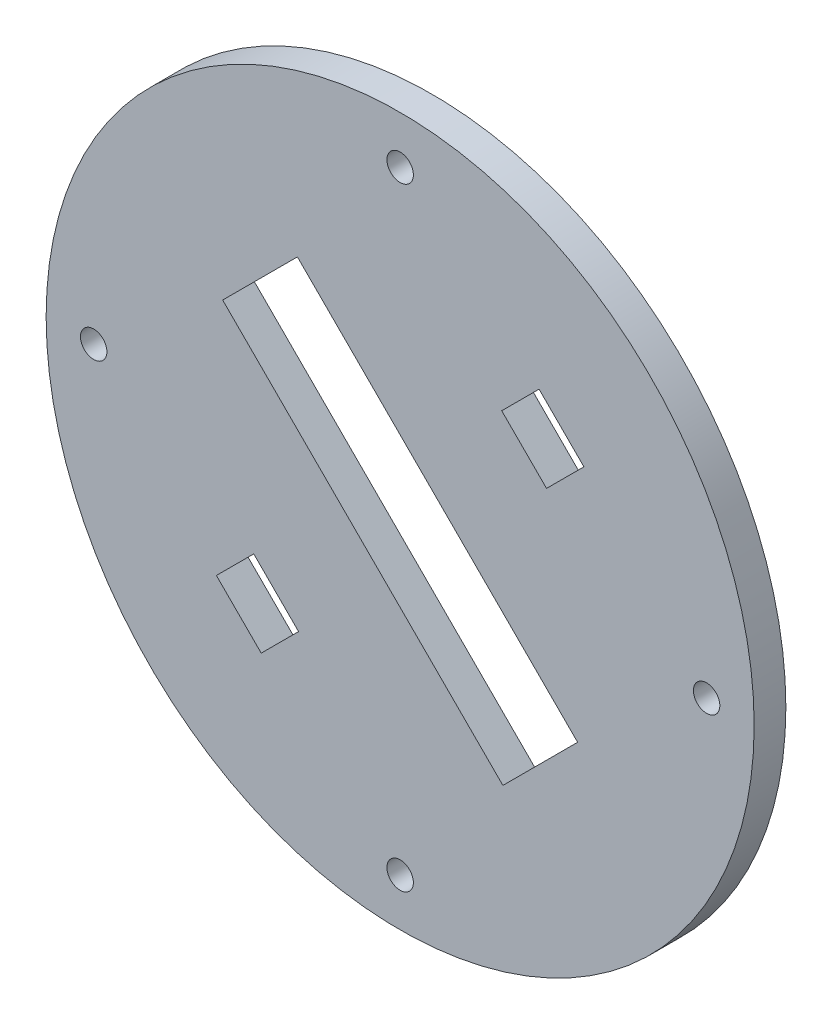
ISO-10303-21;
HEADER;
FILE_DESCRIPTION(('STEP AP214'),'2;1');
FILE_NAME('part.step','',(''),(''),'','','');
FILE_SCHEMA(('AUTOMOTIVE_DESIGN { 1 0 10303 214 1 1 1 1 }'));
ENDSEC;
DATA;
#1=APPLICATION_CONTEXT('core data for automotive mechanical design processes');
#2=APPLICATION_PROTOCOL_DEFINITION('international standard','automotive_design',2000,#1);
#3=PRODUCT_CONTEXT('',#1,'mechanical');
#4=PRODUCT('Part','Part','',(#3));
#5=PRODUCT_RELATED_PRODUCT_CATEGORY('part','',(#4));
#6=PRODUCT_DEFINITION_FORMATION('','',#4);
#7=PRODUCT_DEFINITION_CONTEXT('part definition',#1,'design');
#8=PRODUCT_DEFINITION('design','',#6,#7);
#9=PRODUCT_DEFINITION_SHAPE('','',#8);
#10=(LENGTH_UNIT() NAMED_UNIT(*) SI_UNIT(.MILLI.,.METRE.));
#11=(NAMED_UNIT(*) PLANE_ANGLE_UNIT() SI_UNIT($,.RADIAN.));
#12=(NAMED_UNIT(*) SI_UNIT($,.STERADIAN.) SOLID_ANGLE_UNIT());
#13=UNCERTAINTY_MEASURE_WITH_UNIT(LENGTH_MEASURE(1.E-05),#10,'distance_accuracy_value','');
#14=(GEOMETRIC_REPRESENTATION_CONTEXT(3) GLOBAL_UNCERTAINTY_ASSIGNED_CONTEXT((#13)) GLOBAL_UNIT_ASSIGNED_CONTEXT((#10,
#11,#12)) REPRESENTATION_CONTEXT('',''));
#15=CARTESIAN_POINT('',(0.,0.,0.));
#16=DIRECTION('',(0.,0.,1.));
#17=DIRECTION('',(1.,0.,0.));
#18=AXIS2_PLACEMENT_3D('',#15,#16,#17);
#19=CARTESIAN_POINT('',(0.,0.,6.));
#20=DIRECTION('',(0.,0.,1.));
#21=DIRECTION('',(1.,0.,0.));
#22=AXIS2_PLACEMENT_3D('',#19,#20,#21);
#23=PLANE('',#22);
#24=DIRECTION('',(0.70710678118655,-0.707106781186545,0.));
#25=VECTOR('',#24,1.);
#26=CARTESIAN_POINT('',(-30.5355339059326,-30.5355339059328,6.));
#27=LINE('',#26,#25);
#28=CARTESIAN_POINT('',(-34.7781743393153,-26.2928934725502,6.));
#29=VERTEX_POINT('',#28);
#30=CARTESIAN_POINT('',(-26.2928934725501,-34.7781743393153,6.));
#31=VERTEX_POINT('',#30);
#32=EDGE_CURVE('E137',#29,#31,#27,.T.);
#33=ORIENTED_EDGE('',*,*,#32,.F.);
#34=DIRECTION('',(-0.707106781186547,-0.707106781186548,0.));
#35=VECTOR('',#34,1.);
#36=CARTESIAN_POINT('',(-27.7071065274499,-19.2218256606847,6.));
#37=LINE('',#36,#35);
#38=CARTESIAN_POINT('',(-27.7071065274499,-19.2218256606847,6.));
#39=VERTEX_POINT('',#38);
#40=EDGE_CURVE('E144',#39,#29,#37,.T.);
#41=ORIENTED_EDGE('',*,*,#40,.F.);
#42=DIRECTION('',(-0.707106781186551,0.707106781186544,0.));
#43=VECTOR('',#42,1.);
#44=CARTESIAN_POINT('',(-23.4644660940672,-23.4644660940674,6.));
#45=LINE('',#44,#43);
#46=CARTESIAN_POINT('',(-19.2218256606845,-27.70710652745,6.));
#47=VERTEX_POINT('',#46);
#48=EDGE_CURVE('E126',#47,#39,#45,.T.);
#49=ORIENTED_EDGE('',*,*,#48,.F.);
#50=DIRECTION('',(0.707106781186561,0.707106781186534,0.));
#51=VECTOR('',#50,1.);
#52=CARTESIAN_POINT('',(-26.2928934725501,-34.7781743393153,6.));
#53=LINE('',#52,#51);
#54=EDGE_CURVE('E149',#31,#47,#53,.T.);
#55=ORIENTED_EDGE('',*,*,#54,.F.);
#56=EDGE_LOOP('',(#33,#41,#49,#55));
#57=FACE_BOUND('',#56,.T.);
#58=DIRECTION('',(0.707106781186536,0.707106781186559,0.));
#59=VECTOR('',#58,1.);
#60=CARTESIAN_POINT('',(34.7781743393152,26.2928934725497,6.));
#61=LINE('',#60,#59);
#62=CARTESIAN_POINT('',(27.7071065274498,19.2218256606841,6.));
#63=VERTEX_POINT('',#62);
#64=CARTESIAN_POINT('',(34.7781743393152,26.2928934725497,6.));
#65=VERTEX_POINT('',#64);
#66=EDGE_CURVE('E157',#63,#65,#61,.T.);
#67=ORIENTED_EDGE('',*,*,#66,.F.);
#68=DIRECTION('',(0.707106781186541,-0.707106781186554,0.));
#69=VECTOR('',#68,1.);
#70=CARTESIAN_POINT('',(23.4644660940672,23.4644660940668,6.));
#71=LINE('',#70,#69);
#72=CARTESIAN_POINT('',(19.2218256606846,27.7071065274495,6.));
#73=VERTEX_POINT('',#72);
#74=EDGE_CURVE('E192',#73,#63,#71,.T.);
#75=ORIENTED_EDGE('',*,*,#74,.F.);
#76=DIRECTION('',(-0.707106781186549,-0.707106781186546,0.));
#77=VECTOR('',#76,1.);
#78=CARTESIAN_POINT('',(19.2218256606846,27.7071065274495,6.));
#79=LINE('',#78,#77);
#80=CARTESIAN_POINT('',(26.29289347255,34.7781743393149,6.));
#81=VERTEX_POINT('',#80);
#82=EDGE_CURVE('E165',#81,#73,#79,.T.);
#83=ORIENTED_EDGE('',*,*,#82,.F.);
#84=DIRECTION('',(-0.707106781186542,0.707106781186553,0.));
#85=VECTOR('',#84,1.);
#86=CARTESIAN_POINT('',(30.5355339059327,30.5355339059322,6.));
#87=LINE('',#86,#85);
#88=EDGE_CURVE('E194',#65,#81,#87,.T.);
#89=ORIENTED_EDGE('',*,*,#88,.F.);
#90=EDGE_LOOP('',(#67,#75,#83,#89));
#91=FACE_BOUND('',#90,.T.);
#92=CARTESIAN_POINT('',(1.0373899182872E-12,-58.0000000000016,6.));
#93=DIRECTION('',(0.,0.,1.));
#94=DIRECTION('',(1.,0.,0.));
#95=AXIS2_PLACEMENT_3D('',#92,#93,#94);
#96=CIRCLE('',#95,2.5000000000009);
#97=CARTESIAN_POINT('',(2.50000000000194,-58.0000000000016,6.));
#98=VERTEX_POINT('',#97);
#99=EDGE_CURVE('E203',#98,#98,#96,.T.);
#100=ORIENTED_EDGE('',*,*,#99,.F.);
#101=EDGE_LOOP('',(#100));
#102=FACE_BOUND('',#101,.T.);
#103=CARTESIAN_POINT('',(2.2382195213345E-12,58.0000000000016,6.));
#104=DIRECTION('',(0.,0.,1.));
#105=DIRECTION('',(1.,0.,0.));
#106=AXIS2_PLACEMENT_3D('',#103,#104,#105);
#107=CIRCLE('',#106,2.49999999999738);
#108=CARTESIAN_POINT('',(2.49999999999962,58.0000000000016,6.));
#109=VERTEX_POINT('',#108);
#110=EDGE_CURVE('E215',#109,#109,#107,.T.);
#111=ORIENTED_EDGE('',*,*,#110,.F.);
#112=EDGE_LOOP('',(#111));
#113=FACE_BOUND('',#112,.T.);
#114=CARTESIAN_POINT('',(0.,0.,6.));
#115=DIRECTION('',(0.,0.,1.));
#116=DIRECTION('',(1.,0.,0.));
#117=AXIS2_PLACEMENT_3D('',#114,#115,#116);
#118=CIRCLE('',#117,67.);
#119=CARTESIAN_POINT('',(67.,0.,6.));
#120=VERTEX_POINT('',#119);
#121=EDGE_CURVE('E221',#120,#120,#118,.T.);
#122=ORIENTED_EDGE('',*,*,#121,.T.);
#123=EDGE_LOOP('',(#122));
#124=FACE_BOUND('',#123,.T.);
#125=CARTESIAN_POINT('',(58.0000000000033,-6.0041480152365E-13,6.));
#126=DIRECTION('',(0.,0.,1.));
#127=DIRECTION('',(1.,0.,0.));
#128=AXIS2_PLACEMENT_3D('',#125,#126,#127);
#129=CIRCLE('',#128,2.49999999999866);
#130=CARTESIAN_POINT('',(60.5000000000019,-6.0041480152365E-13,6.));
#131=VERTEX_POINT('',#130);
#132=EDGE_CURVE('E209',#131,#131,#129,.T.);
#133=ORIENTED_EDGE('',*,*,#132,.F.);
#134=EDGE_LOOP('',(#133));
#135=FACE_BOUND('',#134,.T.);
#136=CARTESIAN_POINT('',(-58.,6.07517752958705E-13,6.));
#137=DIRECTION('',(0.,0.,1.));
#138=DIRECTION('',(1.,0.,0.));
#139=AXIS2_PLACEMENT_3D('',#136,#137,#138);
#140=CIRCLE('',#139,2.5);
#141=CARTESIAN_POINT('',(-55.5,6.07517752958705E-13,6.));
#142=VERTEX_POINT('',#141);
#143=EDGE_CURVE('E197',#142,#142,#140,.T.);
#144=ORIENTED_EDGE('',*,*,#143,.F.);
#145=EDGE_LOOP('',(#144));
#146=FACE_BOUND('',#145,.T.);
#147=DIRECTION('',(-0.707106781186549,-0.707106781186546,0.));
#148=VECTOR('',#147,1.);
#149=CARTESIAN_POINT('',(-19.44543648263,33.5875721063611,6.));
#150=LINE('',#149,#148);
#151=CARTESIAN_POINT('',(-19.44543648263,33.5875721063611,6.));
#152=VERTEX_POINT('',#151);
#153=CARTESIAN_POINT('',(-33.587572106361,19.4454364826301,6.));
#154=VERTEX_POINT('',#153);
#155=EDGE_CURVE('E183',#152,#154,#150,.T.);
#156=ORIENTED_EDGE('',*,*,#155,.F.);
#157=DIRECTION('',(0.707106781186546,-0.707106781186549,0.));
#158=VECTOR('',#157,1.);
#159=CARTESIAN_POINT('',(-19.44543648263,33.5875721063611,6.));
#160=LINE('',#159,#158);
#161=CARTESIAN_POINT('',(33.587572106361,-19.4454364826301,6.));
#162=VERTEX_POINT('',#161);
#163=EDGE_CURVE('E51',#152,#162,#160,.T.);
#164=ORIENTED_EDGE('',*,*,#163,.T.);
#165=DIRECTION('',(-0.707106781186549,-0.707106781186546,0.));
#166=VECTOR('',#165,1.);
#167=CARTESIAN_POINT('',(33.587572106361,-19.4454364826301,6.));
#168=LINE('',#167,#166);
#169=CARTESIAN_POINT('',(19.44543648263,-33.587572106361,6.));
#170=VERTEX_POINT('',#169);
#171=EDGE_CURVE('E177',#162,#170,#168,.T.);
#172=ORIENTED_EDGE('',*,*,#171,.T.);
#173=DIRECTION('',(0.707106781186546,-0.707106781186549,0.));
#174=VECTOR('',#173,1.);
#175=CARTESIAN_POINT('',(-33.587572106361,19.4454364826301,6.));
#176=LINE('',#175,#174);
#177=EDGE_CURVE('E180',#154,#170,#176,.T.);
#178=ORIENTED_EDGE('',*,*,#177,.F.);
#179=EDGE_LOOP('',(#156,#164,#172,#178));
#180=FACE_BOUND('',#179,.T.);
#181=ADVANCED_FACE('F36',(#57,#91,#102,#113,#124,#135,#146,#180),#23,.T.);
#182=CARTESIAN_POINT('',(0.,0.,0.));
#183=DIRECTION('',(0.,0.,1.));
#184=DIRECTION('',(1.,0.,0.));
#185=AXIS2_PLACEMENT_3D('',#182,#183,#184);
#186=PLANE('',#185);
#187=DIRECTION('',(0.707106781186541,-0.707106781186554,0.));
#188=VECTOR('',#187,1.);
#189=CARTESIAN_POINT('',(23.4644660940672,23.4644660940668,0.));
#190=LINE('',#189,#188);
#191=CARTESIAN_POINT('',(19.2218256606846,27.7071065274495,0.));
#192=VERTEX_POINT('',#191);
#193=CARTESIAN_POINT('',(27.7071065274498,19.2218256606841,0.));
#194=VERTEX_POINT('',#193);
#195=EDGE_CURVE('E224',#192,#194,#190,.T.);
#196=ORIENTED_EDGE('',*,*,#195,.T.);
#197=DIRECTION('',(0.707106781186536,0.707106781186559,0.));
#198=VECTOR('',#197,1.);
#199=CARTESIAN_POINT('',(4.24264043338328,-4.24264043338315,0.));
#200=LINE('',#199,#198);
#201=CARTESIAN_POINT('',(34.7781743393152,26.2928934725497,0.));
#202=VERTEX_POINT('',#201);
#203=EDGE_CURVE('E247',#194,#202,#200,.T.);
#204=ORIENTED_EDGE('',*,*,#203,.T.);
#205=DIRECTION('',(-0.707106781186542,0.707106781186553,0.));
#206=VECTOR('',#205,1.);
#207=CARTESIAN_POINT('',(30.5355339059327,30.5355339059322,0.));
#208=LINE('',#207,#206);
#209=CARTESIAN_POINT('',(26.29289347255,34.7781743393149,0.));
#210=VERTEX_POINT('',#209);
#211=EDGE_CURVE('E228',#202,#210,#208,.T.);
#212=ORIENTED_EDGE('',*,*,#211,.T.);
#213=DIRECTION('',(-0.707106781186549,-0.707106781186546,0.));
#214=VECTOR('',#213,1.);
#215=CARTESIAN_POINT('',(-4.24264043338251,4.24264043338253,0.));
#216=LINE('',#215,#214);
#217=EDGE_CURVE('E244',#210,#192,#216,.T.);
#218=ORIENTED_EDGE('',*,*,#217,.T.);
#219=EDGE_LOOP('',(#196,#204,#212,#218));
#220=FACE_BOUND('',#219,.T.);
#221=CARTESIAN_POINT('',(-58.,6.07517752958705E-13,0.));
#222=DIRECTION('',(0.,0.,1.));
#223=DIRECTION('',(1.,0.,0.));
#224=AXIS2_PLACEMENT_3D('',#221,#222,#223);
#225=CIRCLE('',#224,2.5);
#226=CARTESIAN_POINT('',(-55.5,6.07517752958705E-13,0.));
#227=VERTEX_POINT('',#226);
#228=EDGE_CURVE('E136',#227,#227,#225,.T.);
#229=ORIENTED_EDGE('',*,*,#228,.T.);
#230=EDGE_LOOP('',(#229));
#231=FACE_BOUND('',#230,.T.);
#232=CARTESIAN_POINT('',(1.0373899182872E-12,-58.0000000000016,0.));
#233=DIRECTION('',(0.,0.,1.));
#234=DIRECTION('',(1.,0.,0.));
#235=AXIS2_PLACEMENT_3D('',#232,#233,#234);
#236=CIRCLE('',#235,2.5000000000009);
#237=CARTESIAN_POINT('',(2.50000000000194,-58.0000000000016,0.));
#238=VERTEX_POINT('',#237);
#239=EDGE_CURVE('E200',#238,#238,#236,.T.);
#240=ORIENTED_EDGE('',*,*,#239,.T.);
#241=EDGE_LOOP('',(#240));
#242=FACE_BOUND('',#241,.T.);
#243=CARTESIAN_POINT('',(58.0000000000033,-6.0041480152365E-13,0.));
#244=DIRECTION('',(0.,0.,1.));
#245=DIRECTION('',(1.,0.,0.));
#246=AXIS2_PLACEMENT_3D('',#243,#244,#245);
#247=CIRCLE('',#246,2.49999999999866);
#248=CARTESIAN_POINT('',(60.5000000000019,-6.0041480152365E-13,0.));
#249=VERTEX_POINT('',#248);
#250=EDGE_CURVE('E206',#249,#249,#247,.T.);
#251=ORIENTED_EDGE('',*,*,#250,.T.);
#252=EDGE_LOOP('',(#251));
#253=FACE_BOUND('',#252,.T.);
#254=CARTESIAN_POINT('',(2.2382195213345E-12,58.0000000000016,0.));
#255=DIRECTION('',(0.,0.,1.));
#256=DIRECTION('',(1.,0.,0.));
#257=AXIS2_PLACEMENT_3D('',#254,#255,#256);
#258=CIRCLE('',#257,2.49999999999738);
#259=CARTESIAN_POINT('',(2.49999999999962,58.0000000000016,0.));
#260=VERTEX_POINT('',#259);
#261=EDGE_CURVE('E212',#260,#260,#258,.T.);
#262=ORIENTED_EDGE('',*,*,#261,.T.);
#263=EDGE_LOOP('',(#262));
#264=FACE_BOUND('',#263,.T.);
#265=CARTESIAN_POINT('',(0.,0.,0.));
#266=DIRECTION('',(0.,0.,1.));
#267=DIRECTION('',(1.,0.,0.));
#268=AXIS2_PLACEMENT_3D('',#265,#266,#267);
#269=CIRCLE('',#268,67.);
#270=CARTESIAN_POINT('',(67.,0.,0.));
#271=VERTEX_POINT('',#270);
#272=EDGE_CURVE('E218',#271,#271,#269,.T.);
#273=ORIENTED_EDGE('',*,*,#272,.F.);
#274=EDGE_LOOP('',(#273));
#275=FACE_BOUND('',#274,.T.);
#276=DIRECTION('',(-0.707106781186547,-0.707106781186548,0.));
#277=VECTOR('',#276,1.);
#278=CARTESIAN_POINT('',(-4.24264043338259,4.24264043338258,0.));
#279=LINE('',#278,#277);
#280=CARTESIAN_POINT('',(-27.7071065274499,-19.2218256606847,0.));
#281=VERTEX_POINT('',#280);
#282=CARTESIAN_POINT('',(-34.7781743393153,-26.2928934725502,0.));
#283=VERTEX_POINT('',#282);
#284=EDGE_CURVE('E11',#281,#283,#279,.T.);
#285=ORIENTED_EDGE('',*,*,#284,.T.);
#286=DIRECTION('',(0.70710678118655,-0.707106781186545,0.));
#287=VECTOR('',#286,1.);
#288=CARTESIAN_POINT('',(-30.5355339059326,-30.5355339059328,0.));
#289=LINE('',#288,#287);
#290=CARTESIAN_POINT('',(-26.2928934725501,-34.7781743393153,0.));
#291=VERTEX_POINT('',#290);
#292=EDGE_CURVE('E230',#283,#291,#289,.T.);
#293=ORIENTED_EDGE('',*,*,#292,.T.);
#294=DIRECTION('',(0.707106781186561,0.707106781186534,0.));
#295=VECTOR('',#294,1.);
#296=CARTESIAN_POINT('',(4.24264043338311,-4.24264043338328,0.));
#297=LINE('',#296,#295);
#298=CARTESIAN_POINT('',(-19.2218256606845,-27.70710652745,0.));
#299=VERTEX_POINT('',#298);
#300=EDGE_CURVE('E44',#291,#299,#297,.T.);
#301=ORIENTED_EDGE('',*,*,#300,.T.);
#302=DIRECTION('',(-0.707106781186551,0.707106781186544,0.));
#303=VECTOR('',#302,1.);
#304=CARTESIAN_POINT('',(-23.4644660940672,-23.4644660940674,0.));
#305=LINE('',#304,#303);
#306=EDGE_CURVE('E232',#299,#281,#305,.T.);
#307=ORIENTED_EDGE('',*,*,#306,.T.);
#308=EDGE_LOOP('',(#285,#293,#301,#307));
#309=FACE_BOUND('',#308,.T.);
#310=DIRECTION('',(0.707106781186546,-0.707106781186549,0.));
#311=VECTOR('',#310,1.);
#312=CARTESIAN_POINT('',(7.07106781186549,7.07106781186546,0.));
#313=LINE('',#312,#311);
#314=CARTESIAN_POINT('',(-19.44543648263,33.5875721063611,0.));
#315=VERTEX_POINT('',#314);
#316=CARTESIAN_POINT('',(33.587572106361,-19.4454364826301,0.));
#317=VERTEX_POINT('',#316);
#318=EDGE_CURVE('E242',#315,#317,#313,.T.);
#319=ORIENTED_EDGE('',*,*,#318,.F.);
#320=DIRECTION('',(-0.707106781186549,-0.707106781186546,0.));
#321=VECTOR('',#320,1.);
#322=CARTESIAN_POINT('',(-26.5165042944955,26.5165042944956,0.));
#323=LINE('',#322,#321);
#324=CARTESIAN_POINT('',(-33.587572106361,19.4454364826301,0.));
#325=VERTEX_POINT('',#324);
#326=EDGE_CURVE('E234',#315,#325,#323,.T.);
#327=ORIENTED_EDGE('',*,*,#326,.T.);
#328=DIRECTION('',(0.707106781186546,-0.707106781186549,0.));
#329=VECTOR('',#328,1.);
#330=CARTESIAN_POINT('',(-7.07106781186549,-7.07106781186547,0.));
#331=LINE('',#330,#329);
#332=CARTESIAN_POINT('',(19.44543648263,-33.587572106361,0.));
#333=VERTEX_POINT('',#332);
#334=EDGE_CURVE('E237',#325,#333,#331,.T.);
#335=ORIENTED_EDGE('',*,*,#334,.T.);
#336=DIRECTION('',(-0.707106781186549,-0.707106781186546,0.));
#337=VECTOR('',#336,1.);
#338=CARTESIAN_POINT('',(26.5165042944955,-26.5165042944956,0.));
#339=LINE('',#338,#337);
#340=EDGE_CURVE('E240',#317,#333,#339,.T.);
#341=ORIENTED_EDGE('',*,*,#340,.F.);
#342=EDGE_LOOP('',(#319,#327,#335,#341));
#343=FACE_BOUND('',#342,.T.);
#344=ADVANCED_FACE('F252',(#220,#231,#242,#253,#264,#275,#309,#343),#186,.F.);
#345=CARTESIAN_POINT('',(0.,0.,6.));
#346=DIRECTION('',(0.,0.,-1.));
#347=DIRECTION('',(-1.,0.,0.));
#348=AXIS2_PLACEMENT_3D('',#345,#346,#347);
#349=CYLINDRICAL_SURFACE('',#348,67.);
#350=ORIENTED_EDGE('',*,*,#121,.F.);
#351=EDGE_LOOP('',(#350));
#352=FACE_BOUND('',#351,.T.);
#353=ORIENTED_EDGE('',*,*,#272,.T.);
#354=EDGE_LOOP('',(#353));
#355=FACE_BOUND('',#354,.T.);
#356=ADVANCED_FACE('F38',(#352,#355),#349,.T.);
#357=CARTESIAN_POINT('',(2.2382195213345E-12,58.0000000000016,6.));
#358=DIRECTION('',(0.,0.,-1.));
#359=DIRECTION('',(-1.,0.,0.));
#360=AXIS2_PLACEMENT_3D('',#357,#358,#359);
#361=CYLINDRICAL_SURFACE('',#360,2.49999999999738);
#362=ORIENTED_EDGE('',*,*,#110,.T.);
#363=EDGE_LOOP('',(#362));
#364=FACE_BOUND('',#363,.T.);
#365=ORIENTED_EDGE('',*,*,#261,.F.);
#366=EDGE_LOOP('',(#365));
#367=FACE_BOUND('',#366,.T.);
#368=ADVANCED_FACE('F277',(#364,#367),#361,.F.);
#369=CARTESIAN_POINT('',(58.0000000000033,-6.0041480152365E-13,6.));
#370=DIRECTION('',(0.,0.,-1.));
#371=DIRECTION('',(-1.,0.,0.));
#372=AXIS2_PLACEMENT_3D('',#369,#370,#371);
#373=CYLINDRICAL_SURFACE('',#372,2.49999999999866);
#374=ORIENTED_EDGE('',*,*,#132,.T.);
#375=EDGE_LOOP('',(#374));
#376=FACE_BOUND('',#375,.T.);
#377=ORIENTED_EDGE('',*,*,#250,.F.);
#378=EDGE_LOOP('',(#377));
#379=FACE_BOUND('',#378,.T.);
#380=ADVANCED_FACE('F280',(#376,#379),#373,.F.);
#381=CARTESIAN_POINT('',(1.0373899182872E-12,-58.0000000000016,6.));
#382=DIRECTION('',(0.,0.,-1.));
#383=DIRECTION('',(-1.,0.,0.));
#384=AXIS2_PLACEMENT_3D('',#381,#382,#383);
#385=CYLINDRICAL_SURFACE('',#384,2.5000000000009);
#386=ORIENTED_EDGE('',*,*,#99,.T.);
#387=EDGE_LOOP('',(#386));
#388=FACE_BOUND('',#387,.T.);
#389=ORIENTED_EDGE('',*,*,#239,.F.);
#390=EDGE_LOOP('',(#389));
#391=FACE_BOUND('',#390,.T.);
#392=ADVANCED_FACE('F284',(#388,#391),#385,.F.);
#393=CARTESIAN_POINT('',(-58.,6.07517752958705E-13,6.));
#394=DIRECTION('',(0.,0.,-1.));
#395=DIRECTION('',(-1.,0.,0.));
#396=AXIS2_PLACEMENT_3D('',#393,#394,#395);
#397=CYLINDRICAL_SURFACE('',#396,2.5);
#398=ORIENTED_EDGE('',*,*,#143,.T.);
#399=EDGE_LOOP('',(#398));
#400=FACE_BOUND('',#399,.T.);
#401=ORIENTED_EDGE('',*,*,#228,.F.);
#402=EDGE_LOOP('',(#401));
#403=FACE_BOUND('',#402,.T.);
#404=ADVANCED_FACE('F288',(#400,#403),#397,.F.);
#405=CARTESIAN_POINT('',(26.6464463556699,34.4246214561951,-19.));
#406=DIRECTION('',(0.707106781186553,0.707106781186542,0.));
#407=DIRECTION('',(-0.707106781186542,0.707106781186553,0.));
#408=AXIS2_PLACEMENT_3D('',#405,#406,#407);
#409=PLANE('',#408);
#410=ORIENTED_EDGE('',*,*,#88,.T.);
#411=DIRECTION('',(0.,0.,1.));
#412=VECTOR('',#411,1.);
#413=CARTESIAN_POINT('',(26.29289347255,34.7781743393149,-4.));
#414=LINE('',#413,#412);
#415=EDGE_CURVE('E168',#210,#81,#414,.T.);
#416=ORIENTED_EDGE('',*,*,#415,.F.);
#417=ORIENTED_EDGE('',*,*,#211,.F.);
#418=DIRECTION('',(0.,0.,1.));
#419=VECTOR('',#418,1.);
#420=CARTESIAN_POINT('',(34.7781743393152,26.2928934725497,-4.));
#421=LINE('',#420,#419);
#422=EDGE_CURVE('E159',#202,#65,#421,.T.);
#423=ORIENTED_EDGE('',*,*,#422,.T.);
#424=EDGE_LOOP('',(#410,#416,#417,#423));
#425=FACE_BOUND('',#424,.T.);
#426=ADVANCED_FACE('F292',(#425),#409,.F.);
#427=CARTESIAN_POINT('',(19.5753790512778,27.3535531368562,-19.));
#428=DIRECTION('',(-0.707106781186554,-0.707106781186541,0.));
#429=DIRECTION('',(0.707106781186541,-0.707106781186554,0.));
#430=AXIS2_PLACEMENT_3D('',#427,#428,#429);
#431=PLANE('',#430);
#432=ORIENTED_EDGE('',*,*,#74,.T.);
#433=DIRECTION('',(0.,0.,1.));
#434=VECTOR('',#433,1.);
#435=CARTESIAN_POINT('',(27.7071065274498,19.2218256606841,-4.));
#436=LINE('',#435,#434);
#437=EDGE_CURVE('E162',#194,#63,#436,.T.);
#438=ORIENTED_EDGE('',*,*,#437,.F.);
#439=ORIENTED_EDGE('',*,*,#195,.F.);
#440=DIRECTION('',(0.,0.,1.));
#441=VECTOR('',#440,1.);
#442=CARTESIAN_POINT('',(19.2218256606846,27.7071065274495,-4.));
#443=LINE('',#442,#441);
#444=EDGE_CURVE('E171',#192,#73,#443,.T.);
#445=ORIENTED_EDGE('',*,*,#444,.T.);
#446=EDGE_LOOP('',(#432,#438,#439,#445));
#447=FACE_BOUND('',#446,.T.);
#448=ADVANCED_FACE('F268',(#447),#431,.F.);
#449=CARTESIAN_POINT('',(-27.3535531368566,-19.575379051278,-19.));
#450=DIRECTION('',(0.707106781186544,0.70710678118655,0.));
#451=DIRECTION('',(-0.707106781186551,0.707106781186544,0.));
#452=AXIS2_PLACEMENT_3D('',#449,#450,#451);
#453=PLANE('',#452);
#454=ORIENTED_EDGE('',*,*,#48,.T.);
#455=DIRECTION('',(0.,0.,1.));
#456=VECTOR('',#455,1.);
#457=CARTESIAN_POINT('',(-27.7071065274499,-19.2218256606847,-4.));
#458=LINE('',#457,#456);
#459=EDGE_CURVE('E129',#281,#39,#458,.T.);
#460=ORIENTED_EDGE('',*,*,#459,.F.);
#461=ORIENTED_EDGE('',*,*,#306,.F.);
#462=DIRECTION('',(0.,0.,1.));
#463=VECTOR('',#462,1.);
#464=CARTESIAN_POINT('',(-19.2218256606845,-27.70710652745,-4.));
#465=LINE('',#464,#463);
#466=EDGE_CURVE('E131',#299,#47,#465,.T.);
#467=ORIENTED_EDGE('',*,*,#466,.T.);
#468=EDGE_LOOP('',(#454,#460,#461,#467));
#469=FACE_BOUND('',#468,.T.);
#470=ADVANCED_FACE('F128',(#469),#453,.F.);
#471=CARTESIAN_POINT('',(-34.4246214561955,-26.64644635567,-19.));
#472=DIRECTION('',(-0.707106781186545,-0.70710678118655,0.));
#473=DIRECTION('',(0.70710678118655,-0.707106781186545,0.));
#474=AXIS2_PLACEMENT_3D('',#471,#472,#473);
#475=PLANE('',#474);
#476=ORIENTED_EDGE('',*,*,#32,.T.);
#477=DIRECTION('',(0.,0.,1.));
#478=VECTOR('',#477,1.);
#479=CARTESIAN_POINT('',(-26.2928934725501,-34.7781743393153,-4.));
#480=LINE('',#479,#478);
#481=EDGE_CURVE('E151',#291,#31,#480,.T.);
#482=ORIENTED_EDGE('',*,*,#481,.F.);
#483=ORIENTED_EDGE('',*,*,#292,.F.);
#484=DIRECTION('',(0.,0.,1.));
#485=VECTOR('',#484,1.);
#486=CARTESIAN_POINT('',(-34.7781743393153,-26.2928934725502,-4.));
#487=LINE('',#486,#485);
#488=EDGE_CURVE('E145',#283,#29,#487,.T.);
#489=ORIENTED_EDGE('',*,*,#488,.T.);
#490=EDGE_LOOP('',(#476,#482,#483,#489));
#491=FACE_BOUND('',#490,.T.);
#492=ADVANCED_FACE('F258',(#491),#475,.F.);
#493=CARTESIAN_POINT('',(-19.44543648263,33.5875721063611,-4.));
#494=DIRECTION('',(-0.707106781186549,-0.707106781186546,0.));
#495=DIRECTION('',(0.707106781186546,-0.707106781186549,0.));
#496=AXIS2_PLACEMENT_3D('',#493,#494,#495);
#497=PLANE('',#496);
#498=ORIENTED_EDGE('',*,*,#318,.T.);
#499=DIRECTION('',(0.,0.,1.));
#500=VECTOR('',#499,1.);
#501=CARTESIAN_POINT('',(33.587572106361,-19.4454364826301,-4.));
#502=LINE('',#501,#500);
#503=EDGE_CURVE('E190',#317,#162,#502,.T.);
#504=ORIENTED_EDGE('',*,*,#503,.T.);
#505=ORIENTED_EDGE('',*,*,#163,.F.);
#506=DIRECTION('',(0.,0.,1.));
#507=VECTOR('',#506,1.);
#508=CARTESIAN_POINT('',(-19.44543648263,33.5875721063611,-4.));
#509=LINE('',#508,#507);
#510=EDGE_CURVE('E185',#315,#152,#509,.T.);
#511=ORIENTED_EDGE('',*,*,#510,.F.);
#512=EDGE_LOOP('',(#498,#504,#505,#511));
#513=FACE_BOUND('',#512,.T.);
#514=ADVANCED_FACE('F260',(#513),#497,.T.);
#515=CARTESIAN_POINT('',(33.587572106361,-19.4454364826301,-4.));
#516=DIRECTION('',(-0.707106781186546,0.707106781186549,0.));
#517=DIRECTION('',(-0.707106781186549,-0.707106781186546,0.));
#518=AXIS2_PLACEMENT_3D('',#515,#516,#517);
#519=PLANE('',#518);
#520=ORIENTED_EDGE('',*,*,#340,.T.);
#521=DIRECTION('',(0.,0.,1.));
#522=VECTOR('',#521,1.);
#523=CARTESIAN_POINT('',(19.44543648263,-33.587572106361,-4.));
#524=LINE('',#523,#522);
#525=EDGE_CURVE('E188',#333,#170,#524,.T.);
#526=ORIENTED_EDGE('',*,*,#525,.T.);
#527=ORIENTED_EDGE('',*,*,#171,.F.);
#528=ORIENTED_EDGE('',*,*,#503,.F.);
#529=EDGE_LOOP('',(#520,#526,#527,#528));
#530=FACE_BOUND('',#529,.T.);
#531=ADVANCED_FACE('F266',(#530),#519,.T.);
#532=CARTESIAN_POINT('',(-33.587572106361,19.4454364826301,-4.));
#533=DIRECTION('',(-0.707106781186549,-0.707106781186546,0.));
#534=DIRECTION('',(0.707106781186546,-0.707106781186549,0.));
#535=AXIS2_PLACEMENT_3D('',#532,#533,#534);
#536=PLANE('',#535);
#537=DIRECTION('',(0.,0.,1.));
#538=VECTOR('',#537,1.);
#539=CARTESIAN_POINT('',(-33.587572106361,19.4454364826301,-4.));
#540=LINE('',#539,#538);
#541=EDGE_CURVE('E59',#325,#154,#540,.T.);
#542=ORIENTED_EDGE('',*,*,#541,.T.);
#543=ORIENTED_EDGE('',*,*,#177,.T.);
#544=ORIENTED_EDGE('',*,*,#525,.F.);
#545=ORIENTED_EDGE('',*,*,#334,.F.);
#546=EDGE_LOOP('',(#542,#543,#544,#545));
#547=FACE_BOUND('',#546,.T.);
#548=ADVANCED_FACE('F327',(#547),#536,.F.);
#549=CARTESIAN_POINT('',(-19.44543648263,33.5875721063611,-4.));
#550=DIRECTION('',(-0.707106781186546,0.707106781186549,0.));
#551=DIRECTION('',(-0.707106781186549,-0.707106781186546,0.));
#552=AXIS2_PLACEMENT_3D('',#549,#550,#551);
#553=PLANE('',#552);
#554=ORIENTED_EDGE('',*,*,#510,.T.);
#555=ORIENTED_EDGE('',*,*,#155,.T.);
#556=ORIENTED_EDGE('',*,*,#541,.F.);
#557=ORIENTED_EDGE('',*,*,#326,.F.);
#558=EDGE_LOOP('',(#554,#555,#556,#557));
#559=FACE_BOUND('',#558,.T.);
#560=ADVANCED_FACE('F324',(#559),#553,.F.);
#561=CARTESIAN_POINT('',(-27.7071065274499,-19.2218256606847,-4.));
#562=DIRECTION('',(-0.707106781186548,0.707106781186547,0.));
#563=DIRECTION('',(-0.707106781186547,-0.707106781186548,0.));
#564=AXIS2_PLACEMENT_3D('',#561,#562,#563);
#565=PLANE('',#564);
#566=ORIENTED_EDGE('',*,*,#459,.T.);
#567=ORIENTED_EDGE('',*,*,#40,.T.);
#568=ORIENTED_EDGE('',*,*,#488,.F.);
#569=ORIENTED_EDGE('',*,*,#284,.F.);
#570=EDGE_LOOP('',(#566,#567,#568,#569));
#571=FACE_BOUND('',#570,.T.);
#572=ADVANCED_FACE('F142',(#571),#565,.F.);
#573=CARTESIAN_POINT('',(-26.2928934725501,-34.7781743393153,-4.));
#574=DIRECTION('',(0.707106781186534,-0.707106781186561,0.));
#575=DIRECTION('',(0.707106781186561,0.707106781186534,0.));
#576=AXIS2_PLACEMENT_3D('',#573,#574,#575);
#577=PLANE('',#576);
#578=ORIENTED_EDGE('',*,*,#481,.T.);
#579=ORIENTED_EDGE('',*,*,#54,.T.);
#580=ORIENTED_EDGE('',*,*,#466,.F.);
#581=ORIENTED_EDGE('',*,*,#300,.F.);
#582=EDGE_LOOP('',(#578,#579,#580,#581));
#583=FACE_BOUND('',#582,.T.);
#584=ADVANCED_FACE('F256',(#583),#577,.F.);
#585=CARTESIAN_POINT('',(19.2218256606846,27.7071065274495,-4.));
#586=DIRECTION('',(-0.707106781186546,0.707106781186549,0.));
#587=DIRECTION('',(-0.707106781186549,-0.707106781186546,0.));
#588=AXIS2_PLACEMENT_3D('',#585,#586,#587);
#589=PLANE('',#588);
#590=ORIENTED_EDGE('',*,*,#415,.T.);
#591=ORIENTED_EDGE('',*,*,#82,.T.);
#592=ORIENTED_EDGE('',*,*,#444,.F.);
#593=ORIENTED_EDGE('',*,*,#217,.F.);
#594=EDGE_LOOP('',(#590,#591,#592,#593));
#595=FACE_BOUND('',#594,.T.);
#596=ADVANCED_FACE('F307',(#595),#589,.F.);
#597=CARTESIAN_POINT('',(34.7781743393152,26.2928934725497,-4.));
#598=DIRECTION('',(0.707106781186559,-0.707106781186536,0.));
#599=DIRECTION('',(0.707106781186536,0.707106781186559,0.));
#600=AXIS2_PLACEMENT_3D('',#597,#598,#599);
#601=PLANE('',#600);
#602=ORIENTED_EDGE('',*,*,#437,.T.);
#603=ORIENTED_EDGE('',*,*,#66,.T.);
#604=ORIENTED_EDGE('',*,*,#422,.F.);
#605=ORIENTED_EDGE('',*,*,#203,.F.);
#606=EDGE_LOOP('',(#602,#603,#604,#605));
#607=FACE_BOUND('',#606,.T.);
#608=ADVANCED_FACE('F314',(#607),#601,.F.);
#609=CLOSED_SHELL('',(#181,#344,#356,#368,#380,#392,#404,#426,#448,#470,#492,#514,#531,#548,
#560,#572,#584,#596,#608));
#610=MANIFOLD_SOLID_BREP('B2',#609);
#611=ADVANCED_BREP_SHAPE_REPRESENTATION('',(#18,#610),#14);
#612=SHAPE_DEFINITION_REPRESENTATION(#9,#611);
ENDSEC;
END-ISO-10303-21;
